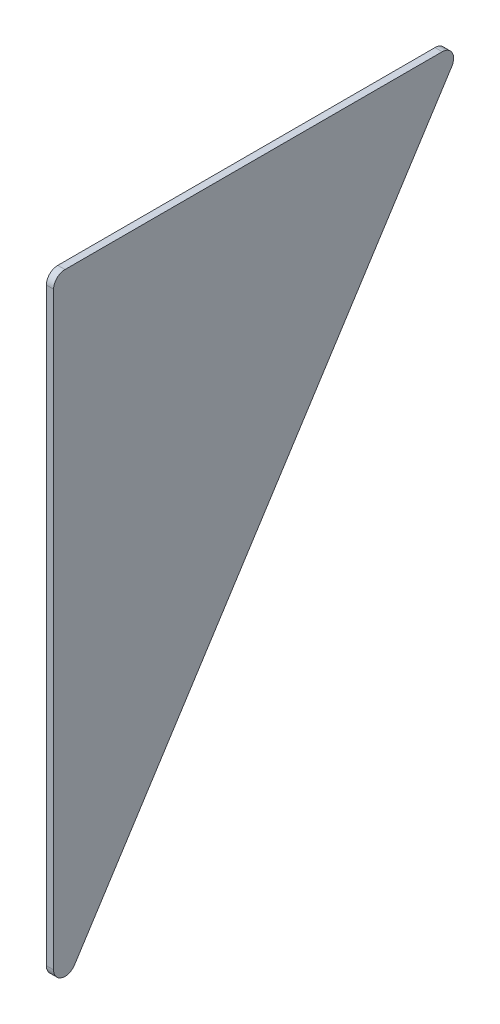
ISO-10303-21;
HEADER;
FILE_DESCRIPTION(('STEP AP214'),'2;1');
FILE_NAME('part.step','',(''),(''),'','','');
FILE_SCHEMA(('AUTOMOTIVE_DESIGN { 1 0 10303 214 1 1 1 1 }'));
ENDSEC;
DATA;
#1=APPLICATION_CONTEXT('core data for automotive mechanical design processes');
#2=APPLICATION_PROTOCOL_DEFINITION('international standard','automotive_design',2000,#1);
#3=PRODUCT_CONTEXT('',#1,'mechanical');
#4=PRODUCT('Part','Part','',(#3));
#5=PRODUCT_RELATED_PRODUCT_CATEGORY('part','',(#4));
#6=PRODUCT_DEFINITION_FORMATION('','',#4);
#7=PRODUCT_DEFINITION_CONTEXT('part definition',#1,'design');
#8=PRODUCT_DEFINITION('design','',#6,#7);
#9=PRODUCT_DEFINITION_SHAPE('','',#8);
#10=(LENGTH_UNIT() NAMED_UNIT(*) SI_UNIT(.MILLI.,.METRE.));
#11=(NAMED_UNIT(*) PLANE_ANGLE_UNIT() SI_UNIT($,.RADIAN.));
#12=(NAMED_UNIT(*) SI_UNIT($,.STERADIAN.) SOLID_ANGLE_UNIT());
#13=UNCERTAINTY_MEASURE_WITH_UNIT(LENGTH_MEASURE(1.E-05),#10,'distance_accuracy_value','');
#14=(GEOMETRIC_REPRESENTATION_CONTEXT(3) GLOBAL_UNCERTAINTY_ASSIGNED_CONTEXT((#13)) GLOBAL_UNIT_ASSIGNED_CONTEXT((#10,
#11,#12)) REPRESENTATION_CONTEXT('',''));
#15=CARTESIAN_POINT('',(0.,0.,0.));
#16=DIRECTION('',(0.,0.,1.));
#17=DIRECTION('',(1.,0.,0.));
#18=AXIS2_PLACEMENT_3D('',#15,#16,#17);
#19=CARTESIAN_POINT('',(3.175,-264.152497941062,-5.00000000000003));
#20=DIRECTION('',(-1.,0.,0.));
#21=DIRECTION('',(0.,0.,1.));
#22=AXIS2_PLACEMENT_3D('',#19,#20,#21);
#23=CYLINDRICAL_SURFACE('',#22,5.);
#24=CARTESIAN_POINT('',(0.,-264.152497941062,-5.00000000000003));
#25=DIRECTION('',(1.,0.,0.));
#26=DIRECTION('',(0.,0.,-1.));
#27=AXIS2_PLACEMENT_3D('',#24,#25,#26);
#28=CIRCLE('',#27,5.);
#29=CARTESIAN_POINT('',(0.,-264.152497941062,0.));
#30=VERTEX_POINT('',#29);
#31=CARTESIAN_POINT('',(0.,-266.847834409622,-9.21131349121044));
#32=VERTEX_POINT('',#31);
#33=EDGE_CURVE('E120',#30,#32,#28,.T.);
#34=ORIENTED_EDGE('',*,*,#33,.T.);
#35=DIRECTION('',(-1.,0.,0.));
#36=VECTOR('',#35,1.);
#37=CARTESIAN_POINT('',(3.175,-266.847834409622,-9.21131349121044));
#38=LINE('',#37,#36);
#39=CARTESIAN_POINT('',(3.175,-266.847834409622,-9.21131349121044));
#40=VERTEX_POINT('',#39);
#41=EDGE_CURVE('E11',#40,#32,#38,.T.);
#42=ORIENTED_EDGE('',*,*,#41,.F.);
#43=CARTESIAN_POINT('',(3.175,-264.152497941062,-5.00000000000003));
#44=DIRECTION('',(1.,0.,0.));
#45=DIRECTION('',(0.,0.,-1.));
#46=AXIS2_PLACEMENT_3D('',#43,#44,#45);
#47=CIRCLE('',#46,5.);
#48=CARTESIAN_POINT('',(3.175,-264.152497941062,0.));
#49=VERTEX_POINT('',#48);
#50=EDGE_CURVE('E130',#49,#40,#47,.T.);
#51=ORIENTED_EDGE('',*,*,#50,.F.);
#52=DIRECTION('',(-1.,0.,0.));
#53=VECTOR('',#52,1.);
#54=CARTESIAN_POINT('',(3.175,-264.152497941062,0.));
#55=LINE('',#54,#53);
#56=EDGE_CURVE('E116',#49,#30,#55,.T.);
#57=ORIENTED_EDGE('',*,*,#56,.T.);
#58=EDGE_LOOP('',(#34,#42,#51,#57));
#59=FACE_BOUND('',#58,.T.);
#60=ADVANCED_FACE('F36',(#59),#23,.T.);
#61=CARTESIAN_POINT('',(3.175,-266.847834409622,-9.21131349121044));
#62=DIRECTION('',(0.,0.539067293712027,0.842262698242058));
#63=DIRECTION('',(0.,-0.842262698242058,0.539067293712027));
#64=AXIS2_PLACEMENT_3D('',#61,#62,#63);
#65=PLANE('',#64);
#66=DIRECTION('',(0.,0.842262698242058,-0.539067293712027));
#67=VECTOR('',#66,1.);
#68=CARTESIAN_POINT('',(0.,-266.847834409622,-9.21131349121044));
#69=LINE('',#68,#67);
#70=CARTESIAN_POINT('',(0.,-7.69533646856019,-175.074809542239));
#71=VERTEX_POINT('',#70);
#72=EDGE_CURVE('E123',#32,#71,#69,.T.);
#73=ORIENTED_EDGE('',*,*,#72,.T.);
#74=DIRECTION('',(-1.,0.,0.));
#75=VECTOR('',#74,1.);
#76=CARTESIAN_POINT('',(3.175,-7.69533646856019,-175.074809542239));
#77=LINE('',#76,#75);
#78=CARTESIAN_POINT('',(3.175,-7.69533646856019,-175.074809542239));
#79=VERTEX_POINT('',#78);
#80=EDGE_CURVE('E44',#79,#71,#77,.T.);
#81=ORIENTED_EDGE('',*,*,#80,.F.);
#82=DIRECTION('',(0.,0.842262698242058,-0.539067293712027));
#83=VECTOR('',#82,1.);
#84=CARTESIAN_POINT('',(3.175,-266.847834409622,-9.21131349121044));
#85=LINE('',#84,#83);
#86=EDGE_CURVE('E89',#40,#79,#85,.T.);
#87=ORIENTED_EDGE('',*,*,#86,.F.);
#88=ORIENTED_EDGE('',*,*,#41,.T.);
#89=EDGE_LOOP('',(#73,#81,#87,#88));
#90=FACE_BOUND('',#89,.T.);
#91=ADVANCED_FACE('F154',(#90),#65,.F.);
#92=CARTESIAN_POINT('',(3.175,-5.,-170.863496051028));
#93=DIRECTION('',(-1.,0.,0.));
#94=DIRECTION('',(0.,0.,1.));
#95=AXIS2_PLACEMENT_3D('',#92,#93,#94);
#96=CYLINDRICAL_SURFACE('',#95,5.00000000000001);
#97=CARTESIAN_POINT('',(0.,-5.,-170.863496051028));
#98=DIRECTION('',(1.,0.,0.));
#99=DIRECTION('',(0.,0.,1.));
#100=AXIS2_PLACEMENT_3D('',#97,#98,#99);
#101=CIRCLE('',#100,5.00000000000001);
#102=CARTESIAN_POINT('',(0.,0.,-170.863496051028));
#103=VERTEX_POINT('',#102);
#104=EDGE_CURVE('E125',#71,#103,#101,.T.);
#105=ORIENTED_EDGE('',*,*,#104,.T.);
#106=DIRECTION('',(-1.,0.,0.));
#107=VECTOR('',#106,1.);
#108=CARTESIAN_POINT('',(3.175,0.,-170.863496051028));
#109=LINE('',#108,#107);
#110=CARTESIAN_POINT('',(3.175,0.,-170.863496051028));
#111=VERTEX_POINT('',#110);
#112=EDGE_CURVE('E111',#111,#103,#109,.T.);
#113=ORIENTED_EDGE('',*,*,#112,.F.);
#114=CARTESIAN_POINT('',(3.175,-5.,-170.863496051028));
#115=DIRECTION('',(1.,0.,0.));
#116=DIRECTION('',(0.,0.,1.));
#117=AXIS2_PLACEMENT_3D('',#114,#115,#116);
#118=CIRCLE('',#117,5.00000000000001);
#119=EDGE_CURVE('E102',#79,#111,#118,.T.);
#120=ORIENTED_EDGE('',*,*,#119,.F.);
#121=ORIENTED_EDGE('',*,*,#80,.T.);
#122=EDGE_LOOP('',(#105,#113,#120,#121));
#123=FACE_BOUND('',#122,.T.);
#124=ADVANCED_FACE('F136',(#123),#96,.T.);
#125=CARTESIAN_POINT('',(3.175,0.,-5.00000000000003));
#126=DIRECTION('',(0.,-1.,0.));
#127=DIRECTION('',(0.,0.,-1.));
#128=AXIS2_PLACEMENT_3D('',#125,#126,#127);
#129=PLANE('',#128);
#130=DIRECTION('',(0.,0.,1.));
#131=VECTOR('',#130,1.);
#132=CARTESIAN_POINT('',(0.,0.,-5.00000000000003));
#133=LINE('',#132,#131);
#134=CARTESIAN_POINT('',(0.,0.,-5.00000000000003));
#135=VERTEX_POINT('',#134);
#136=EDGE_CURVE('E110',#103,#135,#133,.T.);
#137=ORIENTED_EDGE('',*,*,#136,.T.);
#138=DIRECTION('',(-1.,0.,0.));
#139=VECTOR('',#138,1.);
#140=CARTESIAN_POINT('',(3.175,0.,-5.00000000000003));
#141=LINE('',#140,#139);
#142=CARTESIAN_POINT('',(3.175,0.,-5.00000000000003));
#143=VERTEX_POINT('',#142);
#144=EDGE_CURVE('E107',#143,#135,#141,.T.);
#145=ORIENTED_EDGE('',*,*,#144,.F.);
#146=DIRECTION('',(0.,0.,1.));
#147=VECTOR('',#146,1.);
#148=CARTESIAN_POINT('',(3.175,0.,-5.00000000000003));
#149=LINE('',#148,#147);
#150=EDGE_CURVE('E96',#111,#143,#149,.T.);
#151=ORIENTED_EDGE('',*,*,#150,.F.);
#152=ORIENTED_EDGE('',*,*,#112,.T.);
#153=EDGE_LOOP('',(#137,#145,#151,#152));
#154=FACE_BOUND('',#153,.T.);
#155=ADVANCED_FACE('F108',(#154),#129,.F.);
#156=CARTESIAN_POINT('',(3.175,-5.,-5.));
#157=DIRECTION('',(-1.,0.,0.));
#158=DIRECTION('',(0.,0.,1.));
#159=AXIS2_PLACEMENT_3D('',#156,#157,#158);
#160=CYLINDRICAL_SURFACE('',#159,5.);
#161=CARTESIAN_POINT('',(0.,-5.,-5.));
#162=DIRECTION('',(1.,0.,0.));
#163=DIRECTION('',(0.,0.,-1.));
#164=AXIS2_PLACEMENT_3D('',#161,#162,#163);
#165=CIRCLE('',#164,5.);
#166=CARTESIAN_POINT('',(0.,-5.00000000000003,0.));
#167=VERTEX_POINT('',#166);
#168=EDGE_CURVE('E75',#135,#167,#165,.T.);
#169=ORIENTED_EDGE('',*,*,#168,.T.);
#170=DIRECTION('',(-1.,0.,0.));
#171=VECTOR('',#170,1.);
#172=CARTESIAN_POINT('',(3.175,-5.00000000000003,0.));
#173=LINE('',#172,#171);
#174=CARTESIAN_POINT('',(3.175,-5.00000000000003,0.));
#175=VERTEX_POINT('',#174);
#176=EDGE_CURVE('E112',#175,#167,#173,.T.);
#177=ORIENTED_EDGE('',*,*,#176,.F.);
#178=CARTESIAN_POINT('',(3.175,-5.,-5.));
#179=DIRECTION('',(1.,0.,0.));
#180=DIRECTION('',(0.,0.,-1.));
#181=AXIS2_PLACEMENT_3D('',#178,#179,#180);
#182=CIRCLE('',#181,5.);
#183=EDGE_CURVE('E100',#143,#175,#182,.T.);
#184=ORIENTED_EDGE('',*,*,#183,.F.);
#185=ORIENTED_EDGE('',*,*,#144,.T.);
#186=EDGE_LOOP('',(#169,#177,#184,#185));
#187=FACE_BOUND('',#186,.T.);
#188=ADVANCED_FACE('F114',(#187),#160,.T.);
#189=CARTESIAN_POINT('',(3.175,-5.00000000000003,0.));
#190=DIRECTION('',(0.,0.,-1.));
#191=DIRECTION('',(0.,1.,0.));
#192=AXIS2_PLACEMENT_3D('',#189,#190,#191);
#193=PLANE('',#192);
#194=DIRECTION('',(0.,-1.,0.));
#195=VECTOR('',#194,1.);
#196=CARTESIAN_POINT('',(0.,-5.00000000000003,0.));
#197=LINE('',#196,#195);
#198=EDGE_CURVE('E81',#167,#30,#197,.T.);
#199=ORIENTED_EDGE('',*,*,#198,.T.);
#200=ORIENTED_EDGE('',*,*,#56,.F.);
#201=DIRECTION('',(0.,-1.,0.));
#202=VECTOR('',#201,1.);
#203=CARTESIAN_POINT('',(3.175,-5.00000000000003,0.));
#204=LINE('',#203,#202);
#205=EDGE_CURVE('E52',#175,#49,#204,.T.);
#206=ORIENTED_EDGE('',*,*,#205,.F.);
#207=ORIENTED_EDGE('',*,*,#176,.T.);
#208=EDGE_LOOP('',(#199,#200,#206,#207));
#209=FACE_BOUND('',#208,.T.);
#210=ADVANCED_FACE('F143',(#209),#193,.F.);
#211=CARTESIAN_POINT('',(3.175,-264.152497941062,-5.00000000000003));
#212=DIRECTION('',(1.,0.,0.));
#213=DIRECTION('',(0.,0.,-1.));
#214=AXIS2_PLACEMENT_3D('',#211,#212,#213);
#215=PLANE('',#214);
#216=ORIENTED_EDGE('',*,*,#50,.T.);
#217=ORIENTED_EDGE('',*,*,#86,.T.);
#218=ORIENTED_EDGE('',*,*,#119,.T.);
#219=ORIENTED_EDGE('',*,*,#150,.T.);
#220=ORIENTED_EDGE('',*,*,#183,.T.);
#221=ORIENTED_EDGE('',*,*,#205,.T.);
#222=EDGE_LOOP('',(#216,#217,#218,#219,#220,#221));
#223=FACE_BOUND('',#222,.T.);
#224=ADVANCED_FACE('F98',(#223),#215,.T.);
#225=CARTESIAN_POINT('',(0.,-264.152497941062,-5.00000000000003));
#226=DIRECTION('',(1.,0.,0.));
#227=DIRECTION('',(0.,0.,-1.));
#228=AXIS2_PLACEMENT_3D('',#225,#226,#227);
#229=PLANE('',#228);
#230=ORIENTED_EDGE('',*,*,#33,.F.);
#231=ORIENTED_EDGE('',*,*,#198,.F.);
#232=ORIENTED_EDGE('',*,*,#168,.F.);
#233=ORIENTED_EDGE('',*,*,#136,.F.);
#234=ORIENTED_EDGE('',*,*,#104,.F.);
#235=ORIENTED_EDGE('',*,*,#72,.F.);
#236=EDGE_LOOP('',(#230,#231,#232,#233,#234,#235));
#237=FACE_BOUND('',#236,.T.);
#238=ADVANCED_FACE('F139',(#237),#229,.F.);
#239=CLOSED_SHELL('',(#60,#91,#124,#155,#188,#210,#224,#238));
#240=MANIFOLD_SOLID_BREP('B2',#239);
#241=ADVANCED_BREP_SHAPE_REPRESENTATION('',(#18,#240),#14);
#242=SHAPE_DEFINITION_REPRESENTATION(#9,#241);
ENDSEC;
END-ISO-10303-21;
